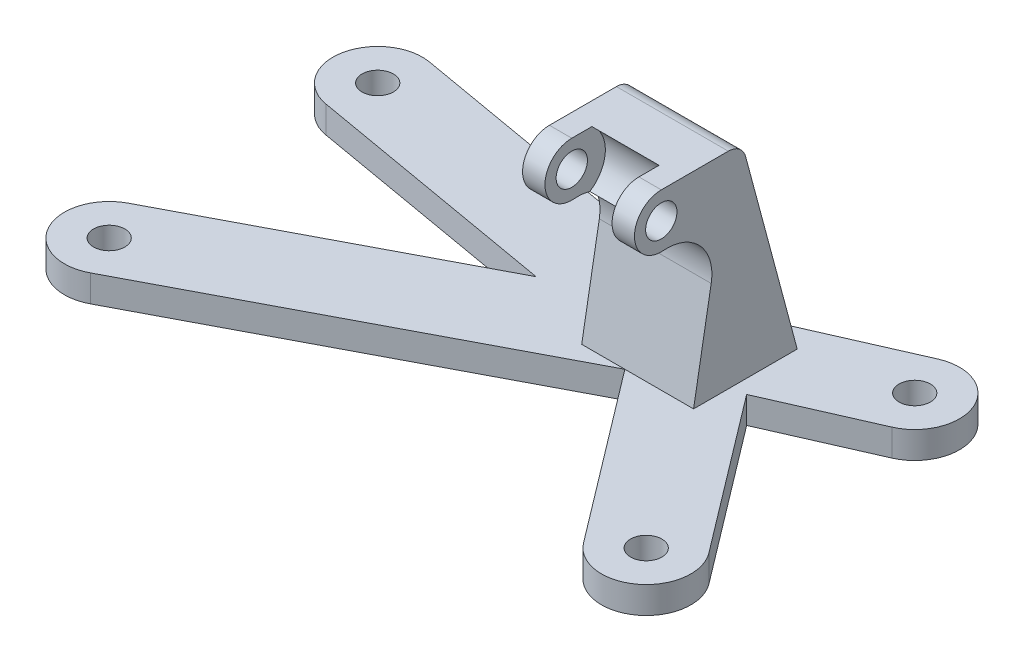
ISO-10303-21;
HEADER;
FILE_DESCRIPTION(('STEP AP214'),'2;1');
FILE_NAME('part.step','',(''),(''),'','','');
FILE_SCHEMA(('AUTOMOTIVE_DESIGN { 1 0 10303 214 1 1 1 1 }'));
ENDSEC;
DATA;
#1=APPLICATION_CONTEXT('core data for automotive mechanical design processes');
#2=APPLICATION_PROTOCOL_DEFINITION('international standard','automotive_design',2000,#1);
#3=PRODUCT_CONTEXT('',#1,'mechanical');
#4=PRODUCT('Part','Part','',(#3));
#5=PRODUCT_RELATED_PRODUCT_CATEGORY('part','',(#4));
#6=PRODUCT_DEFINITION_FORMATION('','',#4);
#7=PRODUCT_DEFINITION_CONTEXT('part definition',#1,'design');
#8=PRODUCT_DEFINITION('design','',#6,#7);
#9=PRODUCT_DEFINITION_SHAPE('','',#8);
#10=(LENGTH_UNIT() NAMED_UNIT(*) SI_UNIT(.MILLI.,.METRE.));
#11=(NAMED_UNIT(*) PLANE_ANGLE_UNIT() SI_UNIT($,.RADIAN.));
#12=(NAMED_UNIT(*) SI_UNIT($,.STERADIAN.) SOLID_ANGLE_UNIT());
#13=UNCERTAINTY_MEASURE_WITH_UNIT(LENGTH_MEASURE(1.E-05),#10,'distance_accuracy_value','');
#14=(GEOMETRIC_REPRESENTATION_CONTEXT(3) GLOBAL_UNCERTAINTY_ASSIGNED_CONTEXT((#13)) GLOBAL_UNIT_ASSIGNED_CONTEXT((#10,
#11,#12)) REPRESENTATION_CONTEXT('',''));
#15=CARTESIAN_POINT('',(0.,0.,0.));
#16=DIRECTION('',(0.,0.,1.));
#17=DIRECTION('',(1.,0.,0.));
#18=AXIS2_PLACEMENT_3D('',#15,#16,#17);
#19=CARTESIAN_POINT('',(6.25,26.,10.));
#20=DIRECTION('',(0.,-1.,0.));
#21=DIRECTION('',(0.,0.,-1.));
#22=AXIS2_PLACEMENT_3D('',#19,#20,#21);
#23=PLANE('',#22);
#24=DIRECTION('',(0.,0.,1.));
#25=VECTOR('',#24,1.);
#26=CARTESIAN_POINT('',(-3.75,26.,10.));
#27=LINE('',#26,#25);
#28=CARTESIAN_POINT('',(-3.75,26.,7.75));
#29=VERTEX_POINT('',#28);
#30=CARTESIAN_POINT('',(-3.75,26.,10.));
#31=VERTEX_POINT('',#30);
#32=EDGE_CURVE('E210',#29,#31,#27,.T.);
#33=ORIENTED_EDGE('',*,*,#32,.F.);
#34=DIRECTION('',(1.,0.,0.));
#35=VECTOR('',#34,1.);
#36=CARTESIAN_POINT('',(-3.75,26.,7.75));
#37=LINE('',#36,#35);
#38=CARTESIAN_POINT('',(3.75,26.,7.75));
#39=VERTEX_POINT('',#38);
#40=EDGE_CURVE('E203',#29,#39,#37,.T.);
#41=ORIENTED_EDGE('',*,*,#40,.T.);
#42=DIRECTION('',(0.,0.,1.));
#43=VECTOR('',#42,1.);
#44=CARTESIAN_POINT('',(3.75,26.,10.));
#45=LINE('',#44,#43);
#46=CARTESIAN_POINT('',(3.75,26.,10.));
#47=VERTEX_POINT('',#46);
#48=EDGE_CURVE('E190',#39,#47,#45,.T.);
#49=ORIENTED_EDGE('',*,*,#48,.T.);
#50=DIRECTION('',(-1.,0.,0.));
#51=VECTOR('',#50,1.);
#52=CARTESIAN_POINT('',(6.25,26.,10.));
#53=LINE('',#52,#51);
#54=CARTESIAN_POINT('',(6.25,26.,10.));
#55=VERTEX_POINT('',#54);
#56=EDGE_CURVE('E264',#55,#47,#53,.T.);
#57=ORIENTED_EDGE('',*,*,#56,.F.);
#58=DIRECTION('',(0.,0.,1.));
#59=VECTOR('',#58,1.);
#60=CARTESIAN_POINT('',(6.25,26.,10.));
#61=LINE('',#60,#59);
#62=CARTESIAN_POINT('',(6.25,26.,2.5120176695391));
#63=VERTEX_POINT('',#62);
#64=EDGE_CURVE('E230',#63,#55,#61,.T.);
#65=ORIENTED_EDGE('',*,*,#64,.F.);
#66=DIRECTION('',(-1.,0.,0.));
#67=VECTOR('',#66,1.);
#68=CARTESIAN_POINT('',(6.25,26.,2.5120176695391));
#69=LINE('',#68,#67);
#70=CARTESIAN_POINT('',(-6.25,26.,2.5120176695391));
#71=VERTEX_POINT('',#70);
#72=EDGE_CURVE('E266',#63,#71,#69,.T.);
#73=ORIENTED_EDGE('',*,*,#72,.T.);
#74=DIRECTION('',(0.,0.,1.));
#75=VECTOR('',#74,1.);
#76=CARTESIAN_POINT('',(-6.25,26.,10.));
#77=LINE('',#76,#75);
#78=CARTESIAN_POINT('',(-6.25,26.,10.));
#79=VERTEX_POINT('',#78);
#80=EDGE_CURVE('E244',#71,#79,#77,.T.);
#81=ORIENTED_EDGE('',*,*,#80,.T.);
#82=EDGE_CURVE('E263',#31,#79,#53,.T.);
#83=ORIENTED_EDGE('',*,*,#82,.F.);
#84=EDGE_LOOP('',(#33,#41,#49,#57,#65,#73,#81,#83));
#85=FACE_BOUND('',#84,.T.);
#86=ADVANCED_FACE('F35',(#85),#23,.F.);
#87=CARTESIAN_POINT('',(6.25,23.,10.));
#88=DIRECTION('',(-1.,0.,0.));
#89=DIRECTION('',(0.,0.,1.));
#90=AXIS2_PLACEMENT_3D('',#87,#88,#89);
#91=CYLINDRICAL_SURFACE('',#90,3.);
#92=CARTESIAN_POINT('',(-3.75,23.,10.));
#93=DIRECTION('',(1.,0.,0.));
#94=DIRECTION('',(0.,0.,-1.));
#95=AXIS2_PLACEMENT_3D('',#92,#93,#94);
#96=CIRCLE('',#95,3.);
#97=CARTESIAN_POINT('',(-3.75,20.0099404001313,9.75598444878842));
#98=VERTEX_POINT('',#97);
#99=EDGE_CURVE('E216',#31,#98,#96,.T.);
#100=ORIENTED_EDGE('',*,*,#99,.F.);
#101=ORIENTED_EDGE('',*,*,#82,.T.);
#102=CARTESIAN_POINT('',(-6.25,23.,10.));
#103=DIRECTION('',(1.,0.,0.));
#104=DIRECTION('',(0.,0.,1.));
#105=AXIS2_PLACEMENT_3D('',#102,#103,#104);
#106=CIRCLE('',#105,3.);
#107=CARTESIAN_POINT('',(-6.25,20.0099404001313,9.75598444878842));
#108=VERTEX_POINT('',#107);
#109=EDGE_CURVE('E247',#79,#108,#106,.T.);
#110=ORIENTED_EDGE('',*,*,#109,.T.);
#111=DIRECTION('',(-1.,0.,0.));
#112=VECTOR('',#111,1.);
#113=CARTESIAN_POINT('',(6.25,20.0099404001313,9.75598444878842));
#114=LINE('',#113,#112);
#115=EDGE_CURVE('E259',#98,#108,#114,.T.);
#116=ORIENTED_EDGE('',*,*,#115,.F.);
#117=EDGE_LOOP('',(#100,#101,#110,#116));
#118=FACE_BOUND('',#117,.T.);
#119=ADVANCED_FACE('F425',(#118),#91,.T.);
#120=CARTESIAN_POINT('',(6.25,15.0265077336835,9.34929186343579));
#121=DIRECTION('',(-1.,0.,0.));
#122=DIRECTION('',(0.,0.,1.));
#123=AXIS2_PLACEMENT_3D('',#120,#121,#122);
#124=CYLINDRICAL_SURFACE('',#123,5.);
#125=CARTESIAN_POINT('',(-3.75,15.0265077336835,9.34929186343579));
#126=DIRECTION('',(1.,0.,0.));
#127=DIRECTION('',(0.,0.,-1.));
#128=AXIS2_PLACEMENT_3D('',#125,#126,#127);
#129=CIRCLE('',#128,5.);
#130=CARTESIAN_POINT('',(-3.75,19.8369586403359,7.98563425439803));
#131=VERTEX_POINT('',#130);
#132=EDGE_CURVE('E390',#98,#131,#129,.F.);
#133=ORIENTED_EDGE('',*,*,#132,.F.);
#134=ORIENTED_EDGE('',*,*,#115,.T.);
#135=CARTESIAN_POINT('',(-6.25,15.0265077336835,9.34929186343579));
#136=DIRECTION('',(-1.,0.,0.));
#137=DIRECTION('',(0.,0.,-1.));
#138=AXIS2_PLACEMENT_3D('',#135,#136,#137);
#139=CIRCLE('',#138,5.);
#140=CARTESIAN_POINT('',(-6.25,14.1582668453488,4.42525309837475));
#141=VERTEX_POINT('',#140);
#142=EDGE_CURVE('E250',#108,#141,#139,.T.);
#143=ORIENTED_EDGE('',*,*,#142,.T.);
#144=DIRECTION('',(-1.,0.,0.));
#145=VECTOR('',#144,1.);
#146=CARTESIAN_POINT('',(6.25,14.1582668453488,4.42525309837475));
#147=LINE('',#146,#145);
#148=CARTESIAN_POINT('',(6.25,14.1582668453488,4.42525309837475));
#149=VERTEX_POINT('',#148);
#150=EDGE_CURVE('E255',#149,#141,#147,.T.);
#151=ORIENTED_EDGE('',*,*,#150,.F.);
#152=CARTESIAN_POINT('',(6.25,15.0265077336835,9.34929186343579));
#153=DIRECTION('',(-1.,0.,0.));
#154=DIRECTION('',(0.,0.,-1.));
#155=AXIS2_PLACEMENT_3D('',#152,#153,#154);
#156=CIRCLE('',#155,5.);
#157=CARTESIAN_POINT('',(6.25,20.0099404001313,9.75598444878842));
#158=VERTEX_POINT('',#157);
#159=EDGE_CURVE('E234',#158,#149,#156,.T.);
#160=ORIENTED_EDGE('',*,*,#159,.F.);
#161=CARTESIAN_POINT('',(3.75,20.0099404001313,9.75598444878842));
#162=VERTEX_POINT('',#161);
#163=EDGE_CURVE('E260',#158,#162,#114,.T.);
#164=ORIENTED_EDGE('',*,*,#163,.T.);
#165=CARTESIAN_POINT('',(3.75,15.0265077336835,9.34929186343579));
#166=DIRECTION('',(1.,0.,0.));
#167=DIRECTION('',(0.,0.,-1.));
#168=AXIS2_PLACEMENT_3D('',#165,#166,#167);
#169=CIRCLE('',#168,5.);
#170=CARTESIAN_POINT('',(3.75,19.8369586403359,7.98563425439803));
#171=VERTEX_POINT('',#170);
#172=EDGE_CURVE('E388',#162,#171,#169,.F.);
#173=ORIENTED_EDGE('',*,*,#172,.T.);
#174=DIRECTION('',(1.,0.,0.));
#175=VECTOR('',#174,1.);
#176=CARTESIAN_POINT('',(0.,19.836958640336,7.98563425439803));
#177=LINE('',#176,#175);
#178=EDGE_CURVE('E11',#171,#131,#177,.F.);
#179=ORIENTED_EDGE('',*,*,#178,.T.);
#180=EDGE_LOOP('',(#133,#134,#143,#151,#160,#164,#173,#179));
#181=FACE_BOUND('',#180,.T.);
#182=ADVANCED_FACE('F402',(#181),#124,.F.);
#183=CARTESIAN_POINT('',(6.25,23.,10.));
#184=DIRECTION('',(-1.,0.,0.));
#185=DIRECTION('',(0.,0.,1.));
#186=AXIS2_PLACEMENT_3D('',#183,#184,#185);
#187=CYLINDRICAL_SURFACE('',#186,1.75);
#188=CARTESIAN_POINT('',(-6.25,23.,10.));
#189=DIRECTION('',(1.,0.,0.));
#190=DIRECTION('',(0.,0.,-1.));
#191=AXIS2_PLACEMENT_3D('',#188,#189,#190);
#192=CIRCLE('',#191,1.75);
#193=CARTESIAN_POINT('',(-6.25,23.,8.25));
#194=VERTEX_POINT('',#193);
#195=EDGE_CURVE('E211',#194,#194,#192,.T.);
#196=ORIENTED_EDGE('',*,*,#195,.F.);
#197=EDGE_LOOP('',(#196));
#198=FACE_BOUND('',#197,.T.);
#199=CARTESIAN_POINT('',(-3.75,23.,10.));
#200=DIRECTION('',(1.,0.,0.));
#201=DIRECTION('',(0.,0.,-1.));
#202=AXIS2_PLACEMENT_3D('',#199,#200,#201);
#203=CIRCLE('',#202,1.75);
#204=CARTESIAN_POINT('',(-3.75,23.,8.25));
#205=VERTEX_POINT('',#204);
#206=EDGE_CURVE('E198',#205,#205,#203,.T.);
#207=ORIENTED_EDGE('',*,*,#206,.T.);
#208=EDGE_LOOP('',(#207));
#209=FACE_BOUND('',#208,.T.);
#210=ADVANCED_FACE('F549',(#198,#209),#187,.F.);
#211=CARTESIAN_POINT('',(-42.93619,3.,22.5));
#212=DIRECTION('',(0.,1.,0.));
#213=DIRECTION('',(0.,0.,1.));
#214=AXIS2_PLACEMENT_3D('',#211,#212,#213);
#215=PLANE('',#214);
#216=DIRECTION('',(-1.,0.,0.));
#217=VECTOR('',#216,1.);
#218=CARTESIAN_POINT('',(6.25,3.,-5.18546773233449));
#219=LINE('',#218,#217);
#220=CARTESIAN_POINT('',(-0.628357098137931,3.,-5.18546773233449));
#221=VERTEX_POINT('',#220);
#222=CARTESIAN_POINT('',(-6.25,3.,-5.18546773233449));
#223=VERTEX_POINT('',#222);
#224=EDGE_CURVE('E43',#221,#223,#219,.T.);
#225=ORIENTED_EDGE('',*,*,#224,.F.);
#226=DIRECTION('',(-0.985084309431401,0.,-0.172072378120544));
#227=VECTOR('',#226,1.);
#228=CARTESIAN_POINT('',(-42.0758281093973,3.,-12.425421547157));
#229=LINE('',#228,#227);
#230=CARTESIAN_POINT('',(-42.0758281093973,3.,-12.425421547157));
#231=VERTEX_POINT('',#230);
#232=EDGE_CURVE('E319',#221,#231,#229,.T.);
#233=ORIENTED_EDGE('',*,*,#232,.T.);
#234=CARTESIAN_POINT('',(-42.93619,3.,-7.49999999999999));
#235=DIRECTION('',(0.,1.,0.));
#236=DIRECTION('',(0.,0.,1.));
#237=AXIS2_PLACEMENT_3D('',#234,#235,#236);
#238=CIRCLE('',#237,5.);
#239=CARTESIAN_POINT('',(-43.7965518906027,3.,-2.57457845284299));
#240=VERTEX_POINT('',#239);
#241=EDGE_CURVE('E321',#231,#240,#238,.T.);
#242=ORIENTED_EDGE('',*,*,#241,.T.);
#243=DIRECTION('',(0.985084309431401,0.,0.172072378120544));
#244=VECTOR('',#243,1.);
#245=CARTESIAN_POINT('',(-43.7965518906027,3.,-2.57457845284299));
#246=LINE('',#245,#244);
#247=CARTESIAN_POINT('',(-15.3434498577951,3.,2.39554733722028));
#248=VERTEX_POINT('',#247);
#249=EDGE_CURVE('E323',#240,#248,#246,.T.);
#250=ORIENTED_EDGE('',*,*,#249,.T.);
#251=DIRECTION('',(-0.885749994533383,0.,0.464162630102977));
#252=VECTOR('',#251,1.);
#253=CARTESIAN_POINT('',(-45.2570031505149,3.,18.0712500273331));
#254=LINE('',#253,#252);
#255=CARTESIAN_POINT('',(-45.2570031505149,3.,18.0712500273331));
#256=VERTEX_POINT('',#255);
#257=EDGE_CURVE('E325',#248,#256,#254,.T.);
#258=ORIENTED_EDGE('',*,*,#257,.T.);
#259=CARTESIAN_POINT('',(-42.93619,3.,22.5));
#260=DIRECTION('',(0.,1.,0.));
#261=DIRECTION('',(0.,0.,1.));
#262=AXIS2_PLACEMENT_3D('',#259,#260,#261);
#263=CIRCLE('',#262,5.);
#264=CARTESIAN_POINT('',(-40.6153768494851,3.,26.9287499726669));
#265=VERTEX_POINT('',#264);
#266=EDGE_CURVE('E299',#256,#265,#263,.T.);
#267=ORIENTED_EDGE('',*,*,#266,.T.);
#268=DIRECTION('',(0.885749994533383,0.,-0.464162630102977));
#269=VECTOR('',#268,1.);
#270=CARTESIAN_POINT('',(-40.6153768494851,3.,26.9287499726669));
#271=LINE('',#270,#269);
#272=CARTESIAN_POINT('',(-1.4270518166852,3.,6.39275660115448));
#273=VERTEX_POINT('',#272);
#274=EDGE_CURVE('E302',#265,#273,#271,.T.);
#275=ORIENTED_EDGE('',*,*,#274,.T.);
#276=DIRECTION('',(-1.,0.,0.));
#277=VECTOR('',#276,1.);
#278=CARTESIAN_POINT('',(6.25,3.,6.39275660115448));
#279=LINE('',#278,#277);
#280=CARTESIAN_POINT('',(-6.25,3.,6.39275660115448));
#281=VERTEX_POINT('',#280);
#282=EDGE_CURVE('E256',#273,#281,#279,.T.);
#283=ORIENTED_EDGE('',*,*,#282,.T.);
#284=DIRECTION('',(0.,0.,-1.));
#285=VECTOR('',#284,1.);
#286=CARTESIAN_POINT('',(-6.25,3.,-5.18546773233449));
#287=LINE('',#286,#285);
#288=EDGE_CURVE('E58',#281,#223,#287,.T.);
#289=ORIENTED_EDGE('',*,*,#288,.T.);
#290=EDGE_LOOP('',(#225,#233,#242,#250,#258,#267,#275,#283,#289));
#291=FACE_BOUND('',#290,.T.);
#292=CARTESIAN_POINT('',(-42.93619,3.,-7.49999999999999));
#293=DIRECTION('',(0.,1.,0.));
#294=DIRECTION('',(0.,0.,1.));
#295=AXIS2_PLACEMENT_3D('',#292,#293,#294);
#296=CIRCLE('',#295,1.75);
#297=CARTESIAN_POINT('',(-42.93619,3.,-5.74999999999999));
#298=VERTEX_POINT('',#297);
#299=EDGE_CURVE('E287',#298,#298,#296,.T.);
#300=ORIENTED_EDGE('',*,*,#299,.F.);
#301=EDGE_LOOP('',(#300));
#302=FACE_BOUND('',#301,.T.);
#303=CARTESIAN_POINT('',(-42.93619,3.,22.5));
#304=DIRECTION('',(0.,1.,0.));
#305=DIRECTION('',(0.,0.,1.));
#306=AXIS2_PLACEMENT_3D('',#303,#304,#305);
#307=CIRCLE('',#306,1.75);
#308=CARTESIAN_POINT('',(-42.93619,3.,24.25));
#309=VERTEX_POINT('',#308);
#310=EDGE_CURVE('E293',#309,#309,#307,.T.);
#311=ORIENTED_EDGE('',*,*,#310,.F.);
#312=EDGE_LOOP('',(#311));
#313=FACE_BOUND('',#312,.T.);
#314=ADVANCED_FACE('F443',(#291,#302,#313),#215,.T.);
#315=CARTESIAN_POINT('',(6.25,3.,-5.18546773233449));
#316=VERTEX_POINT('',#315);
#317=EDGE_CURVE('E272',#316,#221,#219,.T.);
#318=ORIENTED_EDGE('',*,*,#317,.F.);
#319=DIRECTION('',(0.,0.,-1.));
#320=VECTOR('',#319,1.);
#321=CARTESIAN_POINT('',(6.25,3.,-5.18546773233449));
#322=LINE('',#321,#320);
#323=CARTESIAN_POINT('',(6.25,3.,6.39275660115448));
#324=VERTEX_POINT('',#323);
#325=EDGE_CURVE('E222',#324,#316,#322,.T.);
#326=ORIENTED_EDGE('',*,*,#325,.F.);
#327=EDGE_CURVE('E238',#324,#273,#279,.T.);
#328=ORIENTED_EDGE('',*,*,#327,.T.);
#329=DIRECTION('',(0.604270595160017,0.,0.796779171304671));
#330=VECTOR('',#329,1.);
#331=CARTESIAN_POINT('',(13.0799141434766,3.,25.5213529758001));
#332=LINE('',#331,#330);
#333=CARTESIAN_POINT('',(13.0799141434766,3.,25.5213529758001));
#334=VERTEX_POINT('',#333);
#335=EDGE_CURVE('E306',#273,#334,#332,.T.);
#336=ORIENTED_EDGE('',*,*,#335,.T.);
#337=CARTESIAN_POINT('',(17.06381,3.,22.5));
#338=DIRECTION('',(0.,1.,0.));
#339=DIRECTION('',(0.,0.,1.));
#340=AXIS2_PLACEMENT_3D('',#337,#338,#339);
#341=CIRCLE('',#340,5.);
#342=CARTESIAN_POINT('',(21.0477058565234,3.,19.4786470241999));
#343=VERTEX_POINT('',#342);
#344=EDGE_CURVE('E308',#334,#343,#341,.T.);
#345=ORIENTED_EDGE('',*,*,#344,.T.);
#346=DIRECTION('',(-0.604270595160017,0.,-0.796779171304672));
#347=VECTOR('',#346,1.);
#348=CARTESIAN_POINT('',(21.0477058565234,3.,19.4786470241999));
#349=LINE('',#348,#347);
#350=CARTESIAN_POINT('',(7.81299880918282,3.,2.02762591196519));
#351=VERTEX_POINT('',#350);
#352=EDGE_CURVE('E310',#343,#351,#349,.T.);
#353=ORIENTED_EDGE('',*,*,#352,.T.);
#354=DIRECTION('',(0.915474688790862,0.,-0.402375563601064));
#355=VECTOR('',#354,1.);
#356=CARTESIAN_POINT('',(19.0756878180053,3.,-2.92262655604569));
#357=LINE('',#356,#355);
#358=CARTESIAN_POINT('',(19.0756878180053,3.,-2.92262655604569));
#359=VERTEX_POINT('',#358);
#360=EDGE_CURVE('E312',#351,#359,#357,.T.);
#361=ORIENTED_EDGE('',*,*,#360,.T.);
#362=CARTESIAN_POINT('',(17.06381,3.,-7.5));
#363=DIRECTION('',(0.,1.,0.));
#364=DIRECTION('',(0.,0.,1.));
#365=AXIS2_PLACEMENT_3D('',#362,#363,#364);
#366=CIRCLE('',#365,5.);
#367=CARTESIAN_POINT('',(15.0519321819947,3.,-12.0773734439543));
#368=VERTEX_POINT('',#367);
#369=EDGE_CURVE('E314',#359,#368,#366,.T.);
#370=ORIENTED_EDGE('',*,*,#369,.T.);
#371=DIRECTION('',(-0.915474688790862,0.,0.402375563601064));
#372=VECTOR('',#371,1.);
#373=CARTESIAN_POINT('',(15.0519321819947,3.,-12.0773734439543));
#374=LINE('',#373,#372);
#375=EDGE_CURVE('E316',#368,#221,#374,.T.);
#376=ORIENTED_EDGE('',*,*,#375,.T.);
#377=EDGE_LOOP('',(#318,#326,#328,#336,#345,#353,#361,#370,#376));
#378=FACE_BOUND('',#377,.T.);
#379=CARTESIAN_POINT('',(17.06381,3.,-7.5));
#380=DIRECTION('',(0.,1.,0.));
#381=DIRECTION('',(0.,0.,1.));
#382=AXIS2_PLACEMENT_3D('',#379,#380,#381);
#383=CIRCLE('',#382,1.75);
#384=CARTESIAN_POINT('',(17.06381,3.,-5.75));
#385=VERTEX_POINT('',#384);
#386=EDGE_CURVE('E281',#385,#385,#383,.T.);
#387=ORIENTED_EDGE('',*,*,#386,.F.);
#388=EDGE_LOOP('',(#387));
#389=FACE_BOUND('',#388,.T.);
#390=CARTESIAN_POINT('',(17.06381,3.,22.5));
#391=DIRECTION('',(0.,1.,0.));
#392=DIRECTION('',(0.,0.,1.));
#393=AXIS2_PLACEMENT_3D('',#390,#391,#392);
#394=CIRCLE('',#393,1.75);
#395=CARTESIAN_POINT('',(17.06381,3.,24.25));
#396=VERTEX_POINT('',#395);
#397=EDGE_CURVE('E275',#396,#396,#394,.T.);
#398=ORIENTED_EDGE('',*,*,#397,.F.);
#399=EDGE_LOOP('',(#398));
#400=FACE_BOUND('',#399,.T.);
#401=ADVANCED_FACE('F435',(#378,#389,#400),#215,.T.);
#402=CARTESIAN_POINT('',(-42.93619,0.,22.5));
#403=DIRECTION('',(0.,1.,0.));
#404=DIRECTION('',(0.,0.,1.));
#405=AXIS2_PLACEMENT_3D('',#402,#403,#404);
#406=PLANE('',#405);
#407=CARTESIAN_POINT('',(-42.93619,0.,22.5));
#408=DIRECTION('',(0.,1.,0.));
#409=DIRECTION('',(0.,0.,1.));
#410=AXIS2_PLACEMENT_3D('',#407,#408,#409);
#411=CIRCLE('',#410,5.);
#412=CARTESIAN_POINT('',(-45.2570031505149,0.,18.0712500273331));
#413=VERTEX_POINT('',#412);
#414=CARTESIAN_POINT('',(-40.6153768494851,0.,26.9287499726669));
#415=VERTEX_POINT('',#414);
#416=EDGE_CURVE('E296',#413,#415,#411,.T.);
#417=ORIENTED_EDGE('',*,*,#416,.F.);
#418=DIRECTION('',(-0.885749994533383,0.,0.464162630102977));
#419=VECTOR('',#418,1.);
#420=CARTESIAN_POINT('',(-45.2570031505149,0.,18.0712500273331));
#421=LINE('',#420,#419);
#422=CARTESIAN_POINT('',(-15.3434498577951,0.,2.39554733722028));
#423=VERTEX_POINT('',#422);
#424=EDGE_CURVE('E303',#423,#413,#421,.T.);
#425=ORIENTED_EDGE('',*,*,#424,.F.);
#426=DIRECTION('',(0.985084309431401,0.,0.172072378120544));
#427=VECTOR('',#426,1.);
#428=CARTESIAN_POINT('',(-43.7965518906027,0.,-2.57457845284299));
#429=LINE('',#428,#427);
#430=CARTESIAN_POINT('',(-43.7965518906027,0.,-2.57457845284299));
#431=VERTEX_POINT('',#430);
#432=EDGE_CURVE('E348',#431,#423,#429,.T.);
#433=ORIENTED_EDGE('',*,*,#432,.F.);
#434=CARTESIAN_POINT('',(-42.93619,0.,-7.49999999999999));
#435=DIRECTION('',(0.,1.,0.));
#436=DIRECTION('',(0.,0.,1.));
#437=AXIS2_PLACEMENT_3D('',#434,#435,#436);
#438=CIRCLE('',#437,5.);
#439=CARTESIAN_POINT('',(-42.0758281093973,0.,-12.425421547157));
#440=VERTEX_POINT('',#439);
#441=EDGE_CURVE('E346',#440,#431,#438,.T.);
#442=ORIENTED_EDGE('',*,*,#441,.F.);
#443=DIRECTION('',(-0.985084309431401,0.,-0.172072378120544));
#444=VECTOR('',#443,1.);
#445=CARTESIAN_POINT('',(-42.0758281093973,0.,-12.425421547157));
#446=LINE('',#445,#444);
#447=CARTESIAN_POINT('',(-0.628357098138039,0.,-5.18546773233449));
#448=VERTEX_POINT('',#447);
#449=EDGE_CURVE('E344',#448,#440,#446,.T.);
#450=ORIENTED_EDGE('',*,*,#449,.F.);
#451=DIRECTION('',(-0.915474688790862,0.,0.402375563601064));
#452=VECTOR('',#451,1.);
#453=CARTESIAN_POINT('',(15.0519321819947,0.,-12.0773734439543));
#454=LINE('',#453,#452);
#455=CARTESIAN_POINT('',(15.0519321819947,0.,-12.0773734439543));
#456=VERTEX_POINT('',#455);
#457=EDGE_CURVE('E342',#456,#448,#454,.T.);
#458=ORIENTED_EDGE('',*,*,#457,.F.);
#459=CARTESIAN_POINT('',(17.06381,0.,-7.5));
#460=DIRECTION('',(0.,1.,0.));
#461=DIRECTION('',(0.,0.,1.));
#462=AXIS2_PLACEMENT_3D('',#459,#460,#461);
#463=CIRCLE('',#462,5.);
#464=CARTESIAN_POINT('',(19.0756878180053,0.,-2.92262655604569));
#465=VERTEX_POINT('',#464);
#466=EDGE_CURVE('E340',#465,#456,#463,.T.);
#467=ORIENTED_EDGE('',*,*,#466,.F.);
#468=DIRECTION('',(0.915474688790862,0.,-0.402375563601064));
#469=VECTOR('',#468,1.);
#470=CARTESIAN_POINT('',(19.0756878180053,0.,-2.92262655604569));
#471=LINE('',#470,#469);
#472=CARTESIAN_POINT('',(7.81299880918282,0.,2.02762591196519));
#473=VERTEX_POINT('',#472);
#474=EDGE_CURVE('E338',#473,#465,#471,.T.);
#475=ORIENTED_EDGE('',*,*,#474,.F.);
#476=DIRECTION('',(-0.604270595160017,0.,-0.796779171304672));
#477=VECTOR('',#476,1.);
#478=CARTESIAN_POINT('',(21.0477058565234,0.,19.4786470241999));
#479=LINE('',#478,#477);
#480=CARTESIAN_POINT('',(21.0477058565234,0.,19.4786470241999));
#481=VERTEX_POINT('',#480);
#482=EDGE_CURVE('E336',#481,#473,#479,.T.);
#483=ORIENTED_EDGE('',*,*,#482,.F.);
#484=CARTESIAN_POINT('',(17.06381,0.,22.5));
#485=DIRECTION('',(0.,1.,0.));
#486=DIRECTION('',(0.,0.,1.));
#487=AXIS2_PLACEMENT_3D('',#484,#485,#486);
#488=CIRCLE('',#487,5.);
#489=CARTESIAN_POINT('',(13.0799141434766,0.,25.5213529758001));
#490=VERTEX_POINT('',#489);
#491=EDGE_CURVE('E334',#490,#481,#488,.T.);
#492=ORIENTED_EDGE('',*,*,#491,.F.);
#493=DIRECTION('',(0.604270595160017,0.,0.796779171304671));
#494=VECTOR('',#493,1.);
#495=CARTESIAN_POINT('',(13.0799141434766,0.,25.5213529758001));
#496=LINE('',#495,#494);
#497=CARTESIAN_POINT('',(-1.4270518166852,0.,6.39275660115448));
#498=VERTEX_POINT('',#497);
#499=EDGE_CURVE('E332',#498,#490,#496,.T.);
#500=ORIENTED_EDGE('',*,*,#499,.F.);
#501=DIRECTION('',(0.885749994533383,0.,-0.464162630102977));
#502=VECTOR('',#501,1.);
#503=CARTESIAN_POINT('',(-40.6153768494851,0.,26.9287499726669));
#504=LINE('',#503,#502);
#505=EDGE_CURVE('E330',#415,#498,#504,.T.);
#506=ORIENTED_EDGE('',*,*,#505,.F.);
#507=EDGE_LOOP('',(#417,#425,#433,#442,#450,#458,#467,#475,#483,#492,#500,#506));
#508=FACE_BOUND('',#507,.T.);
#509=CARTESIAN_POINT('',(-42.93619,0.,22.5));
#510=DIRECTION('',(0.,1.,0.));
#511=DIRECTION('',(0.,0.,1.));
#512=AXIS2_PLACEMENT_3D('',#509,#510,#511);
#513=CIRCLE('',#512,1.75);
#514=CARTESIAN_POINT('',(-42.93619,0.,24.25));
#515=VERTEX_POINT('',#514);
#516=EDGE_CURVE('E290',#515,#515,#513,.T.);
#517=ORIENTED_EDGE('',*,*,#516,.T.);
#518=EDGE_LOOP('',(#517));
#519=FACE_BOUND('',#518,.T.);
#520=CARTESIAN_POINT('',(-42.93619,0.,-7.49999999999999));
#521=DIRECTION('',(0.,1.,0.));
#522=DIRECTION('',(0.,0.,1.));
#523=AXIS2_PLACEMENT_3D('',#520,#521,#522);
#524=CIRCLE('',#523,1.75);
#525=CARTESIAN_POINT('',(-42.93619,0.,-5.74999999999999));
#526=VERTEX_POINT('',#525);
#527=EDGE_CURVE('E284',#526,#526,#524,.T.);
#528=ORIENTED_EDGE('',*,*,#527,.T.);
#529=EDGE_LOOP('',(#528));
#530=FACE_BOUND('',#529,.T.);
#531=CARTESIAN_POINT('',(17.06381,0.,-7.5));
#532=DIRECTION('',(0.,1.,0.));
#533=DIRECTION('',(0.,0.,1.));
#534=AXIS2_PLACEMENT_3D('',#531,#532,#533);
#535=CIRCLE('',#534,1.75);
#536=CARTESIAN_POINT('',(17.06381,0.,-5.75));
#537=VERTEX_POINT('',#536);
#538=EDGE_CURVE('E278',#537,#537,#535,.T.);
#539=ORIENTED_EDGE('',*,*,#538,.T.);
#540=EDGE_LOOP('',(#539));
#541=FACE_BOUND('',#540,.T.);
#542=CARTESIAN_POINT('',(17.06381,0.,22.5));
#543=DIRECTION('',(0.,1.,0.));
#544=DIRECTION('',(0.,0.,1.));
#545=AXIS2_PLACEMENT_3D('',#542,#543,#544);
#546=CIRCLE('',#545,1.75);
#547=CARTESIAN_POINT('',(17.06381,0.,24.25));
#548=VERTEX_POINT('',#547);
#549=EDGE_CURVE('E274',#548,#548,#546,.T.);
#550=ORIENTED_EDGE('',*,*,#549,.T.);
#551=EDGE_LOOP('',(#550));
#552=FACE_BOUND('',#551,.T.);
#553=ADVANCED_FACE('F501',(#508,#519,#530,#541,#552),#406,.F.);
#554=CARTESIAN_POINT('',(-42.93619,3.,22.5));
#555=DIRECTION('',(0.,-1.,0.));
#556=DIRECTION('',(0.,0.,-1.));
#557=AXIS2_PLACEMENT_3D('',#554,#555,#556);
#558=CYLINDRICAL_SURFACE('',#557,5.);
#559=ORIENTED_EDGE('',*,*,#416,.T.);
#560=DIRECTION('',(0.,-1.,0.));
#561=VECTOR('',#560,1.);
#562=CARTESIAN_POINT('',(-40.6153768494851,3.,26.9287499726669));
#563=LINE('',#562,#561);
#564=EDGE_CURVE('E383',#265,#415,#563,.T.);
#565=ORIENTED_EDGE('',*,*,#564,.F.);
#566=ORIENTED_EDGE('',*,*,#266,.F.);
#567=DIRECTION('',(0.,-1.,0.));
#568=VECTOR('',#567,1.);
#569=CARTESIAN_POINT('',(-45.2570031505149,3.,18.0712500273331));
#570=LINE('',#569,#568);
#571=EDGE_CURVE('E327',#256,#413,#570,.T.);
#572=ORIENTED_EDGE('',*,*,#571,.T.);
#573=EDGE_LOOP('',(#559,#565,#566,#572));
#574=FACE_BOUND('',#573,.T.);
#575=ADVANCED_FACE('F37',(#574),#558,.T.);
#576=CARTESIAN_POINT('',(-40.6153768494851,3.,26.9287499726669));
#577=DIRECTION('',(-0.464162630102977,0.,-0.885749994533383));
#578=DIRECTION('',(-0.885749994533383,0.,0.464162630102977));
#579=AXIS2_PLACEMENT_3D('',#576,#577,#578);
#580=PLANE('',#579);
#581=ORIENTED_EDGE('',*,*,#505,.T.);
#582=DIRECTION('',(0.,-1.,0.));
#583=VECTOR('',#582,1.);
#584=CARTESIAN_POINT('',(-1.4270518166852,3.,6.39275660115448));
#585=LINE('',#584,#583);
#586=EDGE_CURVE('E380',#273,#498,#585,.T.);
#587=ORIENTED_EDGE('',*,*,#586,.F.);
#588=ORIENTED_EDGE('',*,*,#274,.F.);
#589=ORIENTED_EDGE('',*,*,#564,.T.);
#590=EDGE_LOOP('',(#581,#587,#588,#589));
#591=FACE_BOUND('',#590,.T.);
#592=ADVANCED_FACE('F499',(#591),#580,.F.);
#593=CARTESIAN_POINT('',(13.0799141434766,3.,25.5213529758001));
#594=DIRECTION('',(0.796779171304672,0.,-0.604270595160017));
#595=DIRECTION('',(-0.604270595160017,0.,-0.796779171304672));
#596=AXIS2_PLACEMENT_3D('',#593,#594,#595);
#597=PLANE('',#596);
#598=ORIENTED_EDGE('',*,*,#499,.T.);
#599=DIRECTION('',(0.,-1.,0.));
#600=VECTOR('',#599,1.);
#601=CARTESIAN_POINT('',(13.0799141434766,3.,25.5213529758001));
#602=LINE('',#601,#600);
#603=EDGE_CURVE('E377',#334,#490,#602,.T.);
#604=ORIENTED_EDGE('',*,*,#603,.F.);
#605=ORIENTED_EDGE('',*,*,#335,.F.);
#606=ORIENTED_EDGE('',*,*,#586,.T.);
#607=EDGE_LOOP('',(#598,#604,#605,#606));
#608=FACE_BOUND('',#607,.T.);
#609=ADVANCED_FACE('F453',(#608),#597,.F.);
#610=CARTESIAN_POINT('',(17.06381,3.,22.5));
#611=DIRECTION('',(0.,-1.,0.));
#612=DIRECTION('',(0.,0.,-1.));
#613=AXIS2_PLACEMENT_3D('',#610,#611,#612);
#614=CYLINDRICAL_SURFACE('',#613,5.);
#615=ORIENTED_EDGE('',*,*,#491,.T.);
#616=DIRECTION('',(0.,-1.,0.));
#617=VECTOR('',#616,1.);
#618=CARTESIAN_POINT('',(21.0477058565234,3.,19.4786470241999));
#619=LINE('',#618,#617);
#620=EDGE_CURVE('E374',#343,#481,#619,.T.);
#621=ORIENTED_EDGE('',*,*,#620,.F.);
#622=ORIENTED_EDGE('',*,*,#344,.F.);
#623=ORIENTED_EDGE('',*,*,#603,.T.);
#624=EDGE_LOOP('',(#615,#621,#622,#623));
#625=FACE_BOUND('',#624,.T.);
#626=ADVANCED_FACE('F457',(#625),#614,.T.);
#627=CARTESIAN_POINT('',(21.0477058565234,3.,19.4786470241999));
#628=DIRECTION('',(-0.796779171304671,0.,0.604270595160017));
#629=DIRECTION('',(0.604270595160017,0.,0.796779171304672));
#630=AXIS2_PLACEMENT_3D('',#627,#628,#629);
#631=PLANE('',#630);
#632=ORIENTED_EDGE('',*,*,#482,.T.);
#633=DIRECTION('',(0.,-1.,0.));
#634=VECTOR('',#633,1.);
#635=CARTESIAN_POINT('',(7.81299880918282,3.,2.02762591196519));
#636=LINE('',#635,#634);
#637=EDGE_CURVE('E371',#351,#473,#636,.T.);
#638=ORIENTED_EDGE('',*,*,#637,.F.);
#639=ORIENTED_EDGE('',*,*,#352,.F.);
#640=ORIENTED_EDGE('',*,*,#620,.T.);
#641=EDGE_LOOP('',(#632,#638,#639,#640));
#642=FACE_BOUND('',#641,.T.);
#643=ADVANCED_FACE('F462',(#642),#631,.F.);
#644=CARTESIAN_POINT('',(19.0756878180053,3.,-2.92262655604569));
#645=DIRECTION('',(-0.402375563601064,0.,-0.915474688790862));
#646=DIRECTION('',(-0.915474688790862,0.,0.402375563601064));
#647=AXIS2_PLACEMENT_3D('',#644,#645,#646);
#648=PLANE('',#647);
#649=ORIENTED_EDGE('',*,*,#474,.T.);
#650=DIRECTION('',(0.,-1.,0.));
#651=VECTOR('',#650,1.);
#652=CARTESIAN_POINT('',(19.0756878180053,3.,-2.92262655604569));
#653=LINE('',#652,#651);
#654=EDGE_CURVE('E368',#359,#465,#653,.T.);
#655=ORIENTED_EDGE('',*,*,#654,.F.);
#656=ORIENTED_EDGE('',*,*,#360,.F.);
#657=ORIENTED_EDGE('',*,*,#637,.T.);
#658=EDGE_LOOP('',(#649,#655,#656,#657));
#659=FACE_BOUND('',#658,.T.);
#660=ADVANCED_FACE('F468',(#659),#648,.F.);
#661=CARTESIAN_POINT('',(17.06381,3.,-7.5));
#662=DIRECTION('',(0.,-1.,0.));
#663=DIRECTION('',(0.,0.,-1.));
#664=AXIS2_PLACEMENT_3D('',#661,#662,#663);
#665=CYLINDRICAL_SURFACE('',#664,5.);
#666=ORIENTED_EDGE('',*,*,#466,.T.);
#667=DIRECTION('',(0.,-1.,0.));
#668=VECTOR('',#667,1.);
#669=CARTESIAN_POINT('',(15.0519321819947,3.,-12.0773734439543));
#670=LINE('',#669,#668);
#671=EDGE_CURVE('E365',#368,#456,#670,.T.);
#672=ORIENTED_EDGE('',*,*,#671,.F.);
#673=ORIENTED_EDGE('',*,*,#369,.F.);
#674=ORIENTED_EDGE('',*,*,#654,.T.);
#675=EDGE_LOOP('',(#666,#672,#673,#674));
#676=FACE_BOUND('',#675,.T.);
#677=ADVANCED_FACE('F472',(#676),#665,.T.);
#678=CARTESIAN_POINT('',(15.0519321819947,3.,-12.0773734439543));
#679=DIRECTION('',(0.402375563601064,0.,0.915474688790862));
#680=DIRECTION('',(0.915474688790862,0.,-0.402375563601064));
#681=AXIS2_PLACEMENT_3D('',#678,#679,#680);
#682=PLANE('',#681);
#683=ORIENTED_EDGE('',*,*,#457,.T.);
#684=DIRECTION('',(0.,-1.,0.));
#685=VECTOR('',#684,1.);
#686=CARTESIAN_POINT('',(-0.628357098138039,3.,-5.18546773233449));
#687=LINE('',#686,#685);
#688=EDGE_CURVE('E362',#221,#448,#687,.T.);
#689=ORIENTED_EDGE('',*,*,#688,.F.);
#690=ORIENTED_EDGE('',*,*,#375,.F.);
#691=ORIENTED_EDGE('',*,*,#671,.T.);
#692=EDGE_LOOP('',(#683,#689,#690,#691));
#693=FACE_BOUND('',#692,.T.);
#694=ADVANCED_FACE('F475',(#693),#682,.F.);
#695=CARTESIAN_POINT('',(-42.0758281093973,3.,-12.425421547157));
#696=DIRECTION('',(-0.172072378120544,0.,0.985084309431401));
#697=DIRECTION('',(0.985084309431401,0.,0.172072378120544));
#698=AXIS2_PLACEMENT_3D('',#695,#696,#697);
#699=PLANE('',#698);
#700=ORIENTED_EDGE('',*,*,#449,.T.);
#701=DIRECTION('',(0.,-1.,0.));
#702=VECTOR('',#701,1.);
#703=CARTESIAN_POINT('',(-42.0758281093973,3.,-12.425421547157));
#704=LINE('',#703,#702);
#705=EDGE_CURVE('E359',#231,#440,#704,.T.);
#706=ORIENTED_EDGE('',*,*,#705,.F.);
#707=ORIENTED_EDGE('',*,*,#232,.F.);
#708=ORIENTED_EDGE('',*,*,#688,.T.);
#709=EDGE_LOOP('',(#700,#706,#707,#708));
#710=FACE_BOUND('',#709,.T.);
#711=ADVANCED_FACE('F478',(#710),#699,.F.);
#712=CARTESIAN_POINT('',(-42.93619,3.,-7.49999999999999));
#713=DIRECTION('',(0.,-1.,0.));
#714=DIRECTION('',(0.,0.,-1.));
#715=AXIS2_PLACEMENT_3D('',#712,#713,#714);
#716=CYLINDRICAL_SURFACE('',#715,5.);
#717=ORIENTED_EDGE('',*,*,#441,.T.);
#718=DIRECTION('',(0.,-1.,0.));
#719=VECTOR('',#718,1.);
#720=CARTESIAN_POINT('',(-43.7965518906027,3.,-2.57457845284299));
#721=LINE('',#720,#719);
#722=EDGE_CURVE('E356',#240,#431,#721,.T.);
#723=ORIENTED_EDGE('',*,*,#722,.F.);
#724=ORIENTED_EDGE('',*,*,#241,.F.);
#725=ORIENTED_EDGE('',*,*,#705,.T.);
#726=EDGE_LOOP('',(#717,#723,#724,#725));
#727=FACE_BOUND('',#726,.T.);
#728=ADVANCED_FACE('F483',(#727),#716,.T.);
#729=CARTESIAN_POINT('',(-43.7965518906027,3.,-2.57457845284299));
#730=DIRECTION('',(0.172072378120544,0.,-0.985084309431401));
#731=DIRECTION('',(-0.985084309431401,0.,-0.172072378120544));
#732=AXIS2_PLACEMENT_3D('',#729,#730,#731);
#733=PLANE('',#732);
#734=ORIENTED_EDGE('',*,*,#432,.T.);
#735=DIRECTION('',(0.,-1.,0.));
#736=VECTOR('',#735,1.);
#737=CARTESIAN_POINT('',(-15.3434498577951,3.,2.39554733722028));
#738=LINE('',#737,#736);
#739=EDGE_CURVE('E353',#248,#423,#738,.T.);
#740=ORIENTED_EDGE('',*,*,#739,.F.);
#741=ORIENTED_EDGE('',*,*,#249,.F.);
#742=ORIENTED_EDGE('',*,*,#722,.T.);
#743=EDGE_LOOP('',(#734,#740,#741,#742));
#744=FACE_BOUND('',#743,.T.);
#745=ADVANCED_FACE('F489',(#744),#733,.F.);
#746=CARTESIAN_POINT('',(-45.2570031505149,3.,18.0712500273331));
#747=DIRECTION('',(0.464162630102976,0.,0.885749994533383));
#748=DIRECTION('',(0.885749994533383,0.,-0.464162630102977));
#749=AXIS2_PLACEMENT_3D('',#746,#747,#748);
#750=PLANE('',#749);
#751=ORIENTED_EDGE('',*,*,#424,.T.);
#752=ORIENTED_EDGE('',*,*,#571,.F.);
#753=ORIENTED_EDGE('',*,*,#257,.F.);
#754=ORIENTED_EDGE('',*,*,#739,.T.);
#755=EDGE_LOOP('',(#751,#752,#753,#754));
#756=FACE_BOUND('',#755,.T.);
#757=ADVANCED_FACE('F493',(#756),#750,.F.);
#758=CARTESIAN_POINT('',(-42.93619,3.,22.5));
#759=DIRECTION('',(0.,-1.,0.));
#760=DIRECTION('',(0.,0.,-1.));
#761=AXIS2_PLACEMENT_3D('',#758,#759,#760);
#762=CYLINDRICAL_SURFACE('',#761,1.75);
#763=ORIENTED_EDGE('',*,*,#310,.T.);
#764=EDGE_LOOP('',(#763));
#765=FACE_BOUND('',#764,.T.);
#766=ORIENTED_EDGE('',*,*,#516,.F.);
#767=EDGE_LOOP('',(#766));
#768=FACE_BOUND('',#767,.T.);
#769=ADVANCED_FACE('F692',(#765,#768),#762,.F.);
#770=CARTESIAN_POINT('',(-42.93619,3.,-7.49999999999999));
#771=DIRECTION('',(0.,-1.,0.));
#772=DIRECTION('',(0.,0.,-1.));
#773=AXIS2_PLACEMENT_3D('',#770,#771,#772);
#774=CYLINDRICAL_SURFACE('',#773,1.75);
#775=ORIENTED_EDGE('',*,*,#299,.T.);
#776=EDGE_LOOP('',(#775));
#777=FACE_BOUND('',#776,.T.);
#778=ORIENTED_EDGE('',*,*,#527,.F.);
#779=EDGE_LOOP('',(#778));
#780=FACE_BOUND('',#779,.T.);
#781=ADVANCED_FACE('F524',(#777,#780),#774,.F.);
#782=CARTESIAN_POINT('',(17.06381,3.,-7.5));
#783=DIRECTION('',(0.,-1.,0.));
#784=DIRECTION('',(0.,0.,-1.));
#785=AXIS2_PLACEMENT_3D('',#782,#783,#784);
#786=CYLINDRICAL_SURFACE('',#785,1.75);
#787=ORIENTED_EDGE('',*,*,#386,.T.);
#788=EDGE_LOOP('',(#787));
#789=FACE_BOUND('',#788,.T.);
#790=ORIENTED_EDGE('',*,*,#538,.F.);
#791=EDGE_LOOP('',(#790));
#792=FACE_BOUND('',#791,.T.);
#793=ADVANCED_FACE('F515',(#789,#792),#786,.F.);
#794=CARTESIAN_POINT('',(17.06381,3.,22.5));
#795=DIRECTION('',(0.,-1.,0.));
#796=DIRECTION('',(0.,0.,-1.));
#797=AXIS2_PLACEMENT_3D('',#794,#795,#796);
#798=CYLINDRICAL_SURFACE('',#797,1.75);
#799=ORIENTED_EDGE('',*,*,#397,.T.);
#800=EDGE_LOOP('',(#799));
#801=FACE_BOUND('',#800,.T.);
#802=ORIENTED_EDGE('',*,*,#549,.F.);
#803=EDGE_LOOP('',(#802));
#804=FACE_BOUND('',#803,.T.);
#805=ADVANCED_FACE('F513',(#801,#804),#798,.F.);
#806=CARTESIAN_POINT('',(6.25,15.0265077336835,9.34929186343579));
#807=DIRECTION('',(1.,0.,0.));
#808=DIRECTION('',(0.,0.,-1.));
#809=AXIS2_PLACEMENT_3D('',#806,#807,#808);
#810=PLANE('',#809);
#811=ORIENTED_EDGE('',*,*,#325,.T.);
#812=DIRECTION('',(0.,0.96592582628907,0.258819045102515));
#813=VECTOR('',#812,1.);
#814=CARTESIAN_POINT('',(6.25,24.517638090205,0.580166016960965));
#815=LINE('',#814,#813);
#816=CARTESIAN_POINT('',(6.25,24.517638090205,0.580166016960966));
#817=VERTEX_POINT('',#816);
#818=EDGE_CURVE('E225',#316,#817,#815,.T.);
#819=ORIENTED_EDGE('',*,*,#818,.T.);
#820=CARTESIAN_POINT('',(6.25,24.,2.5120176695391));
#821=DIRECTION('',(1.,0.,0.));
#822=DIRECTION('',(0.,0.,-1.));
#823=AXIS2_PLACEMENT_3D('',#820,#821,#822);
#824=CIRCLE('',#823,2.);
#825=EDGE_CURVE('E228',#817,#63,#824,.T.);
#826=ORIENTED_EDGE('',*,*,#825,.T.);
#827=ORIENTED_EDGE('',*,*,#64,.T.);
#828=CARTESIAN_POINT('',(6.25,23.,10.));
#829=DIRECTION('',(1.,0.,0.));
#830=DIRECTION('',(0.,0.,1.));
#831=AXIS2_PLACEMENT_3D('',#828,#829,#830);
#832=CIRCLE('',#831,3.);
#833=EDGE_CURVE('E232',#55,#158,#832,.T.);
#834=ORIENTED_EDGE('',*,*,#833,.T.);
#835=ORIENTED_EDGE('',*,*,#159,.T.);
#836=DIRECTION('',(0.,-0.984807753012208,0.173648177666931));
#837=VECTOR('',#836,1.);
#838=CARTESIAN_POINT('',(6.25,3.,6.39275660115448));
#839=LINE('',#838,#837);
#840=EDGE_CURVE('E236',#149,#324,#839,.T.);
#841=ORIENTED_EDGE('',*,*,#840,.T.);
#842=EDGE_LOOP('',(#811,#819,#826,#827,#834,#835,#841));
#843=FACE_BOUND('',#842,.T.);
#844=CARTESIAN_POINT('',(6.25,23.,10.));
#845=DIRECTION('',(1.,0.,0.));
#846=DIRECTION('',(0.,0.,-1.));
#847=AXIS2_PLACEMENT_3D('',#844,#845,#846);
#848=CIRCLE('',#847,1.75);
#849=CARTESIAN_POINT('',(6.25,23.,8.25));
#850=VERTEX_POINT('',#849);
#851=EDGE_CURVE('E214',#850,#850,#848,.T.);
#852=ORIENTED_EDGE('',*,*,#851,.F.);
#853=EDGE_LOOP('',(#852));
#854=FACE_BOUND('',#853,.T.);
#855=ADVANCED_FACE('F413',(#843,#854),#810,.T.);
#856=CARTESIAN_POINT('',(-6.25,15.0265077336835,9.34929186343579));
#857=DIRECTION('',(1.,0.,0.));
#858=DIRECTION('',(0.,0.,-1.));
#859=AXIS2_PLACEMENT_3D('',#856,#857,#858);
#860=PLANE('',#859);
#861=ORIENTED_EDGE('',*,*,#288,.F.);
#862=DIRECTION('',(0.,-0.984807753012208,0.173648177666931));
#863=VECTOR('',#862,1.);
#864=CARTESIAN_POINT('',(-6.25,3.,6.39275660115448));
#865=LINE('',#864,#863);
#866=EDGE_CURVE('E226',#141,#281,#865,.T.);
#867=ORIENTED_EDGE('',*,*,#866,.F.);
#868=ORIENTED_EDGE('',*,*,#142,.F.);
#869=ORIENTED_EDGE('',*,*,#109,.F.);
#870=ORIENTED_EDGE('',*,*,#80,.F.);
#871=CARTESIAN_POINT('',(-6.25,24.,2.5120176695391));
#872=DIRECTION('',(1.,0.,0.));
#873=DIRECTION('',(0.,0.,-1.));
#874=AXIS2_PLACEMENT_3D('',#871,#872,#873);
#875=CIRCLE('',#874,2.);
#876=CARTESIAN_POINT('',(-6.25,24.517638090205,0.580166016960966));
#877=VERTEX_POINT('',#876);
#878=EDGE_CURVE('E242',#877,#71,#875,.T.);
#879=ORIENTED_EDGE('',*,*,#878,.F.);
#880=DIRECTION('',(0.,0.96592582628907,0.258819045102515));
#881=VECTOR('',#880,1.);
#882=CARTESIAN_POINT('',(-6.25,24.517638090205,0.580166016960965));
#883=LINE('',#882,#881);
#884=EDGE_CURVE('E240',#223,#877,#883,.T.);
#885=ORIENTED_EDGE('',*,*,#884,.F.);
#886=EDGE_LOOP('',(#861,#867,#868,#869,#870,#879,#885));
#887=FACE_BOUND('',#886,.T.);
#888=ORIENTED_EDGE('',*,*,#195,.T.);
#889=EDGE_LOOP('',(#888));
#890=FACE_BOUND('',#889,.T.);
#891=ADVANCED_FACE('F420',(#887,#890),#860,.F.);
#892=CARTESIAN_POINT('',(6.25,24.517638090205,0.580166016960965));
#893=DIRECTION('',(0.,-0.258819045102515,0.96592582628907));
#894=DIRECTION('',(0.,-0.96592582628907,-0.258819045102515));
#895=AXIS2_PLACEMENT_3D('',#892,#893,#894);
#896=PLANE('',#895);
#897=ORIENTED_EDGE('',*,*,#884,.T.);
#898=DIRECTION('',(-1.,0.,0.));
#899=VECTOR('',#898,1.);
#900=CARTESIAN_POINT('',(6.25,24.517638090205,0.580166016960966));
#901=LINE('',#900,#899);
#902=EDGE_CURVE('E269',#817,#877,#901,.T.);
#903=ORIENTED_EDGE('',*,*,#902,.F.);
#904=ORIENTED_EDGE('',*,*,#818,.F.);
#905=ORIENTED_EDGE('',*,*,#317,.T.);
#906=ORIENTED_EDGE('',*,*,#224,.T.);
#907=EDGE_LOOP('',(#897,#903,#904,#905,#906));
#908=FACE_BOUND('',#907,.T.);
#909=ADVANCED_FACE('F441',(#908),#896,.F.);
#910=CARTESIAN_POINT('',(6.25,24.,2.5120176695391));
#911=DIRECTION('',(-1.,0.,0.));
#912=DIRECTION('',(0.,0.,1.));
#913=AXIS2_PLACEMENT_3D('',#910,#911,#912);
#914=CYLINDRICAL_SURFACE('',#913,2.);
#915=ORIENTED_EDGE('',*,*,#878,.T.);
#916=ORIENTED_EDGE('',*,*,#72,.F.);
#917=ORIENTED_EDGE('',*,*,#825,.F.);
#918=ORIENTED_EDGE('',*,*,#902,.T.);
#919=EDGE_LOOP('',(#915,#916,#917,#918));
#920=FACE_BOUND('',#919,.T.);
#921=ADVANCED_FACE('F418',(#920),#914,.T.);
#922=ORIENTED_EDGE('',*,*,#56,.T.);
#923=CARTESIAN_POINT('',(3.75,23.,10.));
#924=DIRECTION('',(1.,0.,0.));
#925=DIRECTION('',(0.,0.,-1.));
#926=AXIS2_PLACEMENT_3D('',#923,#924,#925);
#927=CIRCLE('',#926,3.);
#928=EDGE_CURVE('E193',#47,#162,#927,.T.);
#929=ORIENTED_EDGE('',*,*,#928,.T.);
#930=ORIENTED_EDGE('',*,*,#163,.F.);
#931=ORIENTED_EDGE('',*,*,#833,.F.);
#932=EDGE_LOOP('',(#922,#929,#930,#931));
#933=FACE_BOUND('',#932,.T.);
#934=ADVANCED_FACE('F407',(#933),#91,.T.);
#935=CARTESIAN_POINT('',(6.25,3.,6.39275660115448));
#936=DIRECTION('',(0.,-0.173648177666931,-0.984807753012208));
#937=DIRECTION('',(0.,0.984807753012208,-0.173648177666931));
#938=AXIS2_PLACEMENT_3D('',#935,#936,#937);
#939=PLANE('',#938);
#940=ORIENTED_EDGE('',*,*,#866,.T.);
#941=ORIENTED_EDGE('',*,*,#282,.F.);
#942=ORIENTED_EDGE('',*,*,#327,.F.);
#943=ORIENTED_EDGE('',*,*,#840,.F.);
#944=ORIENTED_EDGE('',*,*,#150,.T.);
#945=EDGE_LOOP('',(#940,#941,#942,#943,#944));
#946=FACE_BOUND('',#945,.T.);
#947=ADVANCED_FACE('F429',(#946),#939,.F.);
#948=CARTESIAN_POINT('',(3.75,23.,10.));
#949=DIRECTION('',(1.,0.,0.));
#950=DIRECTION('',(0.,0.,-1.));
#951=AXIS2_PLACEMENT_3D('',#948,#949,#950);
#952=CIRCLE('',#951,1.75);
#953=CARTESIAN_POINT('',(3.75,23.,8.25));
#954=VERTEX_POINT('',#953);
#955=EDGE_CURVE('E386',#954,#954,#952,.T.);
#956=ORIENTED_EDGE('',*,*,#955,.F.);
#957=EDGE_LOOP('',(#956));
#958=FACE_BOUND('',#957,.T.);
#959=ORIENTED_EDGE('',*,*,#851,.T.);
#960=EDGE_LOOP('',(#959));
#961=FACE_BOUND('',#960,.T.);
#962=ADVANCED_FACE('F547',(#958,#961),#187,.F.);
#963=CARTESIAN_POINT('',(-3.75,23.,10.));
#964=DIRECTION('',(1.,0.,0.));
#965=DIRECTION('',(0.,0.,-1.));
#966=AXIS2_PLACEMENT_3D('',#963,#964,#965);
#967=CYLINDRICAL_SURFACE('',#966,3.75);
#968=CARTESIAN_POINT('',(-3.75,23.,10.));
#969=DIRECTION('',(1.,0.,0.));
#970=DIRECTION('',(0.,0.,-1.));
#971=AXIS2_PLACEMENT_3D('',#968,#969,#970);
#972=CIRCLE('',#971,3.75);
#973=EDGE_CURVE('E206',#131,#29,#972,.T.);
#974=ORIENTED_EDGE('',*,*,#973,.F.);
#975=ORIENTED_EDGE('',*,*,#178,.F.);
#976=CARTESIAN_POINT('',(3.75,23.,10.));
#977=DIRECTION('',(1.,0.,0.));
#978=DIRECTION('',(0.,0.,-1.));
#979=AXIS2_PLACEMENT_3D('',#976,#977,#978);
#980=CIRCLE('',#979,3.75);
#981=EDGE_CURVE('E50',#171,#39,#980,.T.);
#982=ORIENTED_EDGE('',*,*,#981,.T.);
#983=ORIENTED_EDGE('',*,*,#40,.F.);
#984=EDGE_LOOP('',(#974,#975,#982,#983));
#985=FACE_BOUND('',#984,.T.);
#986=ADVANCED_FACE('F202',(#985),#967,.F.);
#987=CARTESIAN_POINT('',(-3.75,23.,10.));
#988=DIRECTION('',(1.,0.,0.));
#989=DIRECTION('',(0.,0.,-1.));
#990=AXIS2_PLACEMENT_3D('',#987,#988,#989);
#991=PLANE('',#990);
#992=ORIENTED_EDGE('',*,*,#206,.F.);
#993=EDGE_LOOP('',(#992));
#994=FACE_BOUND('',#993,.T.);
#995=ORIENTED_EDGE('',*,*,#32,.T.);
#996=ORIENTED_EDGE('',*,*,#99,.T.);
#997=ORIENTED_EDGE('',*,*,#132,.T.);
#998=ORIENTED_EDGE('',*,*,#973,.T.);
#999=EDGE_LOOP('',(#995,#996,#997,#998));
#1000=FACE_BOUND('',#999,.T.);
#1001=ADVANCED_FACE('F399',(#994,#1000),#991,.T.);
#1002=CARTESIAN_POINT('',(3.75,23.,10.));
#1003=DIRECTION('',(1.,0.,0.));
#1004=DIRECTION('',(0.,0.,-1.));
#1005=AXIS2_PLACEMENT_3D('',#1002,#1003,#1004);
#1006=PLANE('',#1005);
#1007=ORIENTED_EDGE('',*,*,#955,.T.);
#1008=EDGE_LOOP('',(#1007));
#1009=FACE_BOUND('',#1008,.T.);
#1010=ORIENTED_EDGE('',*,*,#981,.F.);
#1011=ORIENTED_EDGE('',*,*,#172,.F.);
#1012=ORIENTED_EDGE('',*,*,#928,.F.);
#1013=ORIENTED_EDGE('',*,*,#48,.F.);
#1014=EDGE_LOOP('',(#1010,#1011,#1012,#1013));
#1015=FACE_BOUND('',#1014,.T.);
#1016=ADVANCED_FACE('F191',(#1009,#1015),#1006,.F.);
#1017=CLOSED_SHELL('',(#86,#119,#182,#210,#314,#401,#553,#575,#592,#609,#626,#643,#660,#677,
#694,#711,#728,#745,#757,#769,#781,#793,#805,#855,#891,#909,#921,#934,#947,#962,#986,#1001,#1016));
#1018=MANIFOLD_SOLID_BREP('B2',#1017);
#1019=ADVANCED_BREP_SHAPE_REPRESENTATION('',(#18,#1018),#14);
#1020=SHAPE_DEFINITION_REPRESENTATION(#9,#1019);
ENDSEC;
END-ISO-10303-21;
